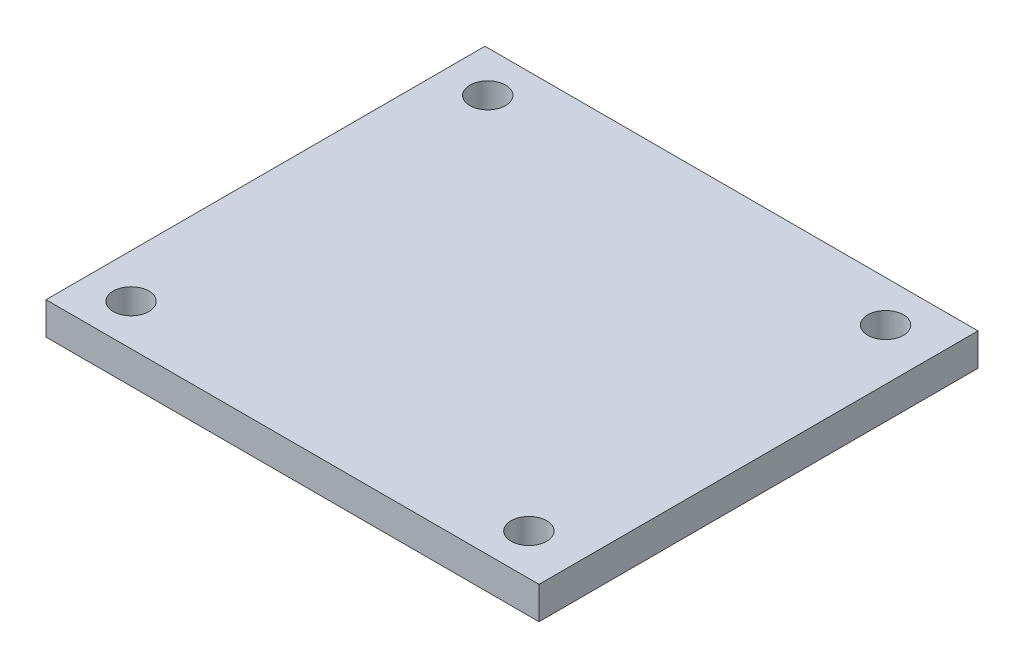
ISO-10303-21;
HEADER;
FILE_DESCRIPTION(('STEP AP214'),'2;1');
FILE_NAME('part.step','',(''),(''),'','','');
FILE_SCHEMA(('AUTOMOTIVE_DESIGN { 1 0 10303 214 1 1 1 1 }'));
ENDSEC;
DATA;
#1=APPLICATION_CONTEXT('core data for automotive mechanical design processes');
#2=APPLICATION_PROTOCOL_DEFINITION('international standard','automotive_design',2000,#1);
#3=PRODUCT_CONTEXT('',#1,'mechanical');
#4=PRODUCT('Part','Part','',(#3));
#5=PRODUCT_RELATED_PRODUCT_CATEGORY('part','',(#4));
#6=PRODUCT_DEFINITION_FORMATION('','',#4);
#7=PRODUCT_DEFINITION_CONTEXT('part definition',#1,'design');
#8=PRODUCT_DEFINITION('design','',#6,#7);
#9=PRODUCT_DEFINITION_SHAPE('','',#8);
#10=(LENGTH_UNIT() NAMED_UNIT(*) SI_UNIT(.MILLI.,.METRE.));
#11=(NAMED_UNIT(*) PLANE_ANGLE_UNIT() SI_UNIT($,.RADIAN.));
#12=(NAMED_UNIT(*) SI_UNIT($,.STERADIAN.) SOLID_ANGLE_UNIT());
#13=UNCERTAINTY_MEASURE_WITH_UNIT(LENGTH_MEASURE(1.E-05),#10,'distance_accuracy_value','');
#14=(GEOMETRIC_REPRESENTATION_CONTEXT(3) GLOBAL_UNCERTAINTY_ASSIGNED_CONTEXT((#13)) GLOBAL_UNIT_ASSIGNED_CONTEXT((#10,
#11,#12)) REPRESENTATION_CONTEXT('',''));
#15=CARTESIAN_POINT('',(0.,0.,0.));
#16=DIRECTION('',(0.,0.,1.));
#17=DIRECTION('',(1.,0.,0.));
#18=AXIS2_PLACEMENT_3D('',#15,#16,#17);
#19=CARTESIAN_POINT('',(-22.82,1.5,-20.32));
#20=DIRECTION('',(1.,0.,0.));
#21=DIRECTION('',(0.,0.,-1.));
#22=AXIS2_PLACEMENT_3D('',#19,#20,#21);
#23=PLANE('',#22);
#24=DIRECTION('',(0.,0.,1.));
#25=VECTOR('',#24,1.);
#26=CARTESIAN_POINT('',(-22.82,0.,-20.32));
#27=LINE('',#26,#25);
#28=CARTESIAN_POINT('',(-22.82,0.,-20.32));
#29=VERTEX_POINT('',#28);
#30=CARTESIAN_POINT('',(-22.82,0.,0.));
#31=VERTEX_POINT('',#30);
#32=EDGE_CURVE('E96',#29,#31,#27,.T.);
#33=ORIENTED_EDGE('',*,*,#32,.T.);
#34=DIRECTION('',(0.,-1.,0.));
#35=VECTOR('',#34,1.);
#36=CARTESIAN_POINT('',(-22.82,1.5,0.));
#37=LINE('',#36,#35);
#38=CARTESIAN_POINT('',(-22.82,1.5,0.));
#39=VERTEX_POINT('',#38);
#40=EDGE_CURVE('E11',#39,#31,#37,.T.);
#41=ORIENTED_EDGE('',*,*,#40,.F.);
#42=DIRECTION('',(0.,0.,1.));
#43=VECTOR('',#42,1.);
#44=CARTESIAN_POINT('',(-22.82,1.5,-20.32));
#45=LINE('',#44,#43);
#46=CARTESIAN_POINT('',(-22.82,1.5,-20.32));
#47=VERTEX_POINT('',#46);
#48=EDGE_CURVE('E82',#47,#39,#45,.T.);
#49=ORIENTED_EDGE('',*,*,#48,.F.);
#50=DIRECTION('',(0.,-1.,0.));
#51=VECTOR('',#50,1.);
#52=CARTESIAN_POINT('',(-22.82,1.5,-20.32));
#53=LINE('',#52,#51);
#54=EDGE_CURVE('E49',#47,#29,#53,.T.);
#55=ORIENTED_EDGE('',*,*,#54,.T.);
#56=EDGE_LOOP('',(#33,#41,#49,#55));
#57=FACE_BOUND('',#56,.T.);
#58=ADVANCED_FACE('F33',(#57),#23,.F.);
#59=CARTESIAN_POINT('',(-22.82,1.5,0.));
#60=DIRECTION('',(0.,0.,-1.));
#61=DIRECTION('',(-1.,0.,0.));
#62=AXIS2_PLACEMENT_3D('',#59,#60,#61);
#63=PLANE('',#62);
#64=DIRECTION('',(1.,0.,0.));
#65=VECTOR('',#64,1.);
#66=CARTESIAN_POINT('',(-22.82,0.,0.));
#67=LINE('',#66,#65);
#68=CARTESIAN_POINT('',(0.,0.,0.));
#69=VERTEX_POINT('',#68);
#70=EDGE_CURVE('E87',#31,#69,#67,.T.);
#71=ORIENTED_EDGE('',*,*,#70,.T.);
#72=DIRECTION('',(0.,-1.,0.));
#73=VECTOR('',#72,1.);
#74=CARTESIAN_POINT('',(0.,1.5,0.));
#75=LINE('',#74,#73);
#76=CARTESIAN_POINT('',(0.,1.5,0.));
#77=VERTEX_POINT('',#76);
#78=EDGE_CURVE('E41',#77,#69,#75,.T.);
#79=ORIENTED_EDGE('',*,*,#78,.F.);
#80=DIRECTION('',(1.,0.,0.));
#81=VECTOR('',#80,1.);
#82=CARTESIAN_POINT('',(-22.82,1.5,0.));
#83=LINE('',#82,#81);
#84=EDGE_CURVE('E74',#39,#77,#83,.T.);
#85=ORIENTED_EDGE('',*,*,#84,.F.);
#86=ORIENTED_EDGE('',*,*,#40,.T.);
#87=EDGE_LOOP('',(#71,#79,#85,#86));
#88=FACE_BOUND('',#87,.T.);
#89=ADVANCED_FACE('F86',(#88),#63,.F.);
#90=CARTESIAN_POINT('',(0.,1.5,-20.32));
#91=DIRECTION('',(1.,0.,0.));
#92=DIRECTION('',(0.,0.,-1.));
#93=AXIS2_PLACEMENT_3D('',#90,#91,#92);
#94=PLANE('',#93);
#95=DIRECTION('',(0.,0.,1.));
#96=VECTOR('',#95,1.);
#97=CARTESIAN_POINT('',(0.,0.,-20.32));
#98=LINE('',#97,#96);
#99=CARTESIAN_POINT('',(0.,0.,-20.32));
#100=VERTEX_POINT('',#99);
#101=EDGE_CURVE('E100',#100,#69,#98,.T.);
#102=ORIENTED_EDGE('',*,*,#101,.F.);
#103=DIRECTION('',(0.,-1.,0.));
#104=VECTOR('',#103,1.);
#105=CARTESIAN_POINT('',(0.,1.5,-20.32));
#106=LINE('',#105,#104);
#107=CARTESIAN_POINT('',(0.,1.5,-20.32));
#108=VERTEX_POINT('',#107);
#109=EDGE_CURVE('E63',#108,#100,#106,.T.);
#110=ORIENTED_EDGE('',*,*,#109,.F.);
#111=DIRECTION('',(0.,0.,1.));
#112=VECTOR('',#111,1.);
#113=CARTESIAN_POINT('',(0.,1.5,-20.32));
#114=LINE('',#113,#112);
#115=EDGE_CURVE('E81',#108,#77,#114,.T.);
#116=ORIENTED_EDGE('',*,*,#115,.T.);
#117=ORIENTED_EDGE('',*,*,#78,.T.);
#118=EDGE_LOOP('',(#102,#110,#116,#117));
#119=FACE_BOUND('',#118,.T.);
#120=ADVANCED_FACE('F90',(#119),#94,.T.);
#121=CARTESIAN_POINT('',(-22.82,1.5,-20.32));
#122=DIRECTION('',(0.,0.,-1.));
#123=DIRECTION('',(-1.,0.,0.));
#124=AXIS2_PLACEMENT_3D('',#121,#122,#123);
#125=PLANE('',#124);
#126=DIRECTION('',(1.,0.,0.));
#127=VECTOR('',#126,1.);
#128=CARTESIAN_POINT('',(-22.82,0.,-20.32));
#129=LINE('',#128,#127);
#130=EDGE_CURVE('E102',#29,#100,#129,.T.);
#131=ORIENTED_EDGE('',*,*,#130,.F.);
#132=ORIENTED_EDGE('',*,*,#54,.F.);
#133=DIRECTION('',(1.,0.,0.));
#134=VECTOR('',#133,1.);
#135=CARTESIAN_POINT('',(-22.82,1.5,-20.32));
#136=LINE('',#135,#134);
#137=EDGE_CURVE('E91',#47,#108,#136,.T.);
#138=ORIENTED_EDGE('',*,*,#137,.T.);
#139=ORIENTED_EDGE('',*,*,#109,.T.);
#140=EDGE_LOOP('',(#131,#132,#138,#139));
#141=FACE_BOUND('',#140,.T.);
#142=ADVANCED_FACE('F137',(#141),#125,.T.);
#143=CARTESIAN_POINT('',(0.,1.5,0.));
#144=DIRECTION('',(0.,1.,0.));
#145=DIRECTION('',(0.,0.,1.));
#146=AXIS2_PLACEMENT_3D('',#143,#144,#145);
#147=PLANE('',#146);
#148=CARTESIAN_POINT('',(-20.788,1.5,-18.415));
#149=DIRECTION('',(0.,1.,0.));
#150=DIRECTION('',(0.,0.,1.));
#151=AXIS2_PLACEMENT_3D('',#148,#149,#150);
#152=CIRCLE('',#151,0.825000000000001);
#153=CARTESIAN_POINT('',(-20.788,1.5,-17.59));
#154=VERTEX_POINT('',#153);
#155=EDGE_CURVE('E117',#154,#154,#152,.T.);
#156=ORIENTED_EDGE('',*,*,#155,.F.);
#157=EDGE_LOOP('',(#156));
#158=FACE_BOUND('',#157,.T.);
#159=CARTESIAN_POINT('',(-2.373,1.5,-18.415));
#160=DIRECTION('',(0.,1.,0.));
#161=DIRECTION('',(0.,0.,1.));
#162=AXIS2_PLACEMENT_3D('',#159,#160,#161);
#163=CIRCLE('',#162,0.825000000000001);
#164=CARTESIAN_POINT('',(-2.373,1.5,-17.59));
#165=VERTEX_POINT('',#164);
#166=EDGE_CURVE('E123',#165,#165,#163,.T.);
#167=ORIENTED_EDGE('',*,*,#166,.F.);
#168=EDGE_LOOP('',(#167));
#169=FACE_BOUND('',#168,.T.);
#170=CARTESIAN_POINT('',(-2.373,1.5,-1.905));
#171=DIRECTION('',(0.,1.,0.));
#172=DIRECTION('',(0.,0.,1.));
#173=AXIS2_PLACEMENT_3D('',#170,#171,#172);
#174=CIRCLE('',#173,0.825);
#175=CARTESIAN_POINT('',(-2.373,1.5,-1.08));
#176=VERTEX_POINT('',#175);
#177=EDGE_CURVE('E111',#176,#176,#174,.T.);
#178=ORIENTED_EDGE('',*,*,#177,.F.);
#179=EDGE_LOOP('',(#178));
#180=FACE_BOUND('',#179,.T.);
#181=CARTESIAN_POINT('',(-20.788,1.5,-1.905));
#182=DIRECTION('',(0.,1.,0.));
#183=DIRECTION('',(0.,0.,1.));
#184=AXIS2_PLACEMENT_3D('',#181,#182,#183);
#185=CIRCLE('',#184,0.825000000000001);
#186=CARTESIAN_POINT('',(-20.788,1.5,-1.08));
#187=VERTEX_POINT('',#186);
#188=EDGE_CURVE('E108',#187,#187,#185,.T.);
#189=ORIENTED_EDGE('',*,*,#188,.F.);
#190=EDGE_LOOP('',(#189));
#191=FACE_BOUND('',#190,.T.);
#192=ORIENTED_EDGE('',*,*,#48,.T.);
#193=ORIENTED_EDGE('',*,*,#84,.T.);
#194=ORIENTED_EDGE('',*,*,#115,.F.);
#195=ORIENTED_EDGE('',*,*,#137,.F.);
#196=EDGE_LOOP('',(#192,#193,#194,#195));
#197=FACE_BOUND('',#196,.T.);
#198=ADVANCED_FACE('F78',(#158,#169,#180,#191,#197),#147,.T.);
#199=CARTESIAN_POINT('',(0.,0.,0.));
#200=DIRECTION('',(0.,1.,0.));
#201=DIRECTION('',(0.,0.,1.));
#202=AXIS2_PLACEMENT_3D('',#199,#200,#201);
#203=PLANE('',#202);
#204=CARTESIAN_POINT('',(-20.788,0.,-18.415));
#205=DIRECTION('',(0.,1.,0.));
#206=DIRECTION('',(0.,0.,1.));
#207=AXIS2_PLACEMENT_3D('',#204,#205,#206);
#208=CIRCLE('',#207,0.825000000000001);
#209=CARTESIAN_POINT('',(-20.788,0.,-17.59));
#210=VERTEX_POINT('',#209);
#211=EDGE_CURVE('E114',#210,#210,#208,.T.);
#212=ORIENTED_EDGE('',*,*,#211,.T.);
#213=EDGE_LOOP('',(#212));
#214=FACE_BOUND('',#213,.T.);
#215=CARTESIAN_POINT('',(-2.373,0.,-18.415));
#216=DIRECTION('',(0.,1.,0.));
#217=DIRECTION('',(0.,0.,1.));
#218=AXIS2_PLACEMENT_3D('',#215,#216,#217);
#219=CIRCLE('',#218,0.825000000000001);
#220=CARTESIAN_POINT('',(-2.373,0.,-17.59));
#221=VERTEX_POINT('',#220);
#222=EDGE_CURVE('E120',#221,#221,#219,.T.);
#223=ORIENTED_EDGE('',*,*,#222,.T.);
#224=EDGE_LOOP('',(#223));
#225=FACE_BOUND('',#224,.T.);
#226=CARTESIAN_POINT('',(-2.373,0.,-1.905));
#227=DIRECTION('',(0.,1.,0.));
#228=DIRECTION('',(0.,0.,1.));
#229=AXIS2_PLACEMENT_3D('',#226,#227,#228);
#230=CIRCLE('',#229,0.825);
#231=CARTESIAN_POINT('',(-2.373,0.,-1.08));
#232=VERTEX_POINT('',#231);
#233=EDGE_CURVE('E126',#232,#232,#230,.T.);
#234=ORIENTED_EDGE('',*,*,#233,.T.);
#235=EDGE_LOOP('',(#234));
#236=FACE_BOUND('',#235,.T.);
#237=CARTESIAN_POINT('',(-20.788,0.,-1.905));
#238=DIRECTION('',(0.,1.,0.));
#239=DIRECTION('',(0.,0.,1.));
#240=AXIS2_PLACEMENT_3D('',#237,#238,#239);
#241=CIRCLE('',#240,0.825000000000001);
#242=CARTESIAN_POINT('',(-20.788,0.,-1.08));
#243=VERTEX_POINT('',#242);
#244=EDGE_CURVE('E98',#243,#243,#241,.T.);
#245=ORIENTED_EDGE('',*,*,#244,.T.);
#246=EDGE_LOOP('',(#245));
#247=FACE_BOUND('',#246,.T.);
#248=ORIENTED_EDGE('',*,*,#32,.F.);
#249=ORIENTED_EDGE('',*,*,#130,.T.);
#250=ORIENTED_EDGE('',*,*,#101,.T.);
#251=ORIENTED_EDGE('',*,*,#70,.F.);
#252=EDGE_LOOP('',(#248,#249,#250,#251));
#253=FACE_BOUND('',#252,.T.);
#254=ADVANCED_FACE('F136',(#214,#225,#236,#247,#253),#203,.F.);
#255=CARTESIAN_POINT('',(-20.788,0.,-1.905));
#256=DIRECTION('',(0.,1.,0.));
#257=DIRECTION('',(0.,0.,1.));
#258=AXIS2_PLACEMENT_3D('',#255,#256,#257);
#259=CYLINDRICAL_SURFACE('',#258,0.825000000000001);
#260=ORIENTED_EDGE('',*,*,#244,.F.);
#261=EDGE_LOOP('',(#260));
#262=FACE_BOUND('',#261,.T.);
#263=ORIENTED_EDGE('',*,*,#188,.T.);
#264=EDGE_LOOP('',(#263));
#265=FACE_BOUND('',#264,.T.);
#266=ADVANCED_FACE('F142',(#262,#265),#259,.F.);
#267=CARTESIAN_POINT('',(-2.373,0.,-1.905));
#268=DIRECTION('',(0.,1.,0.));
#269=DIRECTION('',(0.,0.,1.));
#270=AXIS2_PLACEMENT_3D('',#267,#268,#269);
#271=CYLINDRICAL_SURFACE('',#270,0.825);
#272=ORIENTED_EDGE('',*,*,#233,.F.);
#273=EDGE_LOOP('',(#272));
#274=FACE_BOUND('',#273,.T.);
#275=ORIENTED_EDGE('',*,*,#177,.T.);
#276=EDGE_LOOP('',(#275));
#277=FACE_BOUND('',#276,.T.);
#278=ADVANCED_FACE('F132',(#274,#277),#271,.F.);
#279=CARTESIAN_POINT('',(-2.373,0.,-18.415));
#280=DIRECTION('',(0.,1.,0.));
#281=DIRECTION('',(0.,0.,1.));
#282=AXIS2_PLACEMENT_3D('',#279,#280,#281);
#283=CYLINDRICAL_SURFACE('',#282,0.825000000000001);
#284=ORIENTED_EDGE('',*,*,#222,.F.);
#285=EDGE_LOOP('',(#284));
#286=FACE_BOUND('',#285,.T.);
#287=ORIENTED_EDGE('',*,*,#166,.T.);
#288=EDGE_LOOP('',(#287));
#289=FACE_BOUND('',#288,.T.);
#290=ADVANCED_FACE('F150',(#286,#289),#283,.F.);
#291=CARTESIAN_POINT('',(-20.788,0.,-18.415));
#292=DIRECTION('',(0.,1.,0.));
#293=DIRECTION('',(0.,0.,1.));
#294=AXIS2_PLACEMENT_3D('',#291,#292,#293);
#295=CYLINDRICAL_SURFACE('',#294,0.825000000000001);
#296=ORIENTED_EDGE('',*,*,#211,.F.);
#297=EDGE_LOOP('',(#296));
#298=FACE_BOUND('',#297,.T.);
#299=ORIENTED_EDGE('',*,*,#155,.T.);
#300=EDGE_LOOP('',(#299));
#301=FACE_BOUND('',#300,.T.);
#302=ADVANCED_FACE('F212',(#298,#301),#295,.F.);
#303=CLOSED_SHELL('',(#58,#89,#120,#142,#198,#254,#266,#278,#290,#302));
#304=MANIFOLD_SOLID_BREP('B2',#303);
#305=ADVANCED_BREP_SHAPE_REPRESENTATION('',(#18,#304),#14);
#306=SHAPE_DEFINITION_REPRESENTATION(#9,#305);
ENDSEC;
END-ISO-10303-21;
